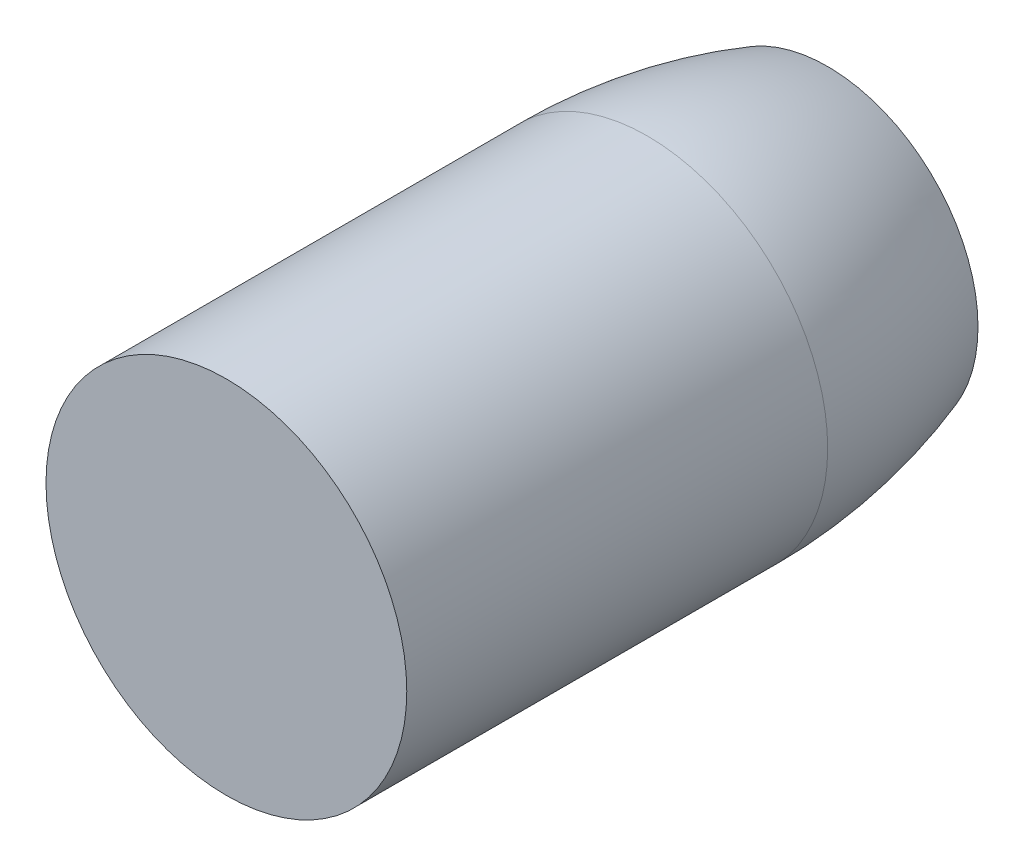
ISO-10303-21;
HEADER;
FILE_DESCRIPTION(('STEP AP214'),'2;1');
FILE_NAME('part.step','',(''),(''),'','','');
FILE_SCHEMA(('AUTOMOTIVE_DESIGN { 1 0 10303 214 1 1 1 1 }'));
ENDSEC;
DATA;
#1=APPLICATION_CONTEXT('core data for automotive mechanical design processes');
#2=APPLICATION_PROTOCOL_DEFINITION('international standard','automotive_design',2000,#1);
#3=PRODUCT_CONTEXT('',#1,'mechanical');
#4=PRODUCT('Part','Part','',(#3));
#5=PRODUCT_RELATED_PRODUCT_CATEGORY('part','',(#4));
#6=PRODUCT_DEFINITION_FORMATION('','',#4);
#7=PRODUCT_DEFINITION_CONTEXT('part definition',#1,'design');
#8=PRODUCT_DEFINITION('design','',#6,#7);
#9=PRODUCT_DEFINITION_SHAPE('','',#8);
#10=(LENGTH_UNIT() NAMED_UNIT(*) SI_UNIT(.MILLI.,.METRE.));
#11=(NAMED_UNIT(*) PLANE_ANGLE_UNIT() SI_UNIT($,.RADIAN.));
#12=(NAMED_UNIT(*) SI_UNIT($,.STERADIAN.) SOLID_ANGLE_UNIT());
#13=UNCERTAINTY_MEASURE_WITH_UNIT(LENGTH_MEASURE(1.E-05),#10,'distance_accuracy_value','');
#14=(GEOMETRIC_REPRESENTATION_CONTEXT(3) GLOBAL_UNCERTAINTY_ASSIGNED_CONTEXT((#13)) GLOBAL_UNIT_ASSIGNED_CONTEXT((#10,
#11,#12)) REPRESENTATION_CONTEXT('',''));
#15=CARTESIAN_POINT('',(0.,0.,0.));
#16=DIRECTION('',(0.,0.,1.));
#17=DIRECTION('',(1.,0.,0.));
#18=AXIS2_PLACEMENT_3D('',#15,#16,#17);
#19=CARTESIAN_POINT('',(0.,0.,0.));
#20=DIRECTION('',(0.,0.,1.));
#21=DIRECTION('',(1.,0.,0.));
#22=AXIS2_PLACEMENT_3D('',#19,#20,#21);
#23=PLANE('',#22);
#24=CARTESIAN_POINT('',(0.,0.,0.));
#25=DIRECTION('',(0.,0.,1.));
#26=DIRECTION('',(1.,0.,0.));
#27=AXIS2_PLACEMENT_3D('',#24,#25,#26);
#28=CIRCLE('',#27,6.);
#29=CARTESIAN_POINT('',(6.,0.,0.));
#30=VERTEX_POINT('',#29);
#31=EDGE_CURVE('E12',#30,#30,#28,.T.);
#32=ORIENTED_EDGE('',*,*,#31,.T.);
#33=EDGE_LOOP('',(#32));
#34=FACE_BOUND('',#33,.T.);
#35=ADVANCED_FACE('F40',(#34),#23,.T.);
#36=CARTESIAN_POINT('',(0.,0.,0.));
#37=DIRECTION('',(0.,0.,1.));
#38=DIRECTION('',(1.,0.,0.));
#39=AXIS2_PLACEMENT_3D('',#36,#37,#38);
#40=CYLINDRICAL_SURFACE('',#39,6.);
#41=CARTESIAN_POINT('',(0.,0.,-14.));
#42=DIRECTION('',(0.,0.,1.));
#43=DIRECTION('',(1.,0.,0.));
#44=AXIS2_PLACEMENT_3D('',#41,#42,#43);
#45=CIRCLE('',#44,6.);
#46=CARTESIAN_POINT('',(6.,0.,-14.));
#47=VERTEX_POINT('',#46);
#48=EDGE_CURVE('E46',#47,#47,#45,.T.);
#49=ORIENTED_EDGE('',*,*,#48,.T.);
#50=EDGE_LOOP('',(#49));
#51=FACE_BOUND('',#50,.T.);
#52=ORIENTED_EDGE('',*,*,#31,.F.);
#53=EDGE_LOOP('',(#52));
#54=FACE_BOUND('',#53,.T.);
#55=ADVANCED_FACE('F75',(#51,#54),#40,.T.);
#56=CARTESIAN_POINT('',(0.,0.,-14.));
#57=DIRECTION('',(0.,0.,1.));
#58=DIRECTION('',(1.,0.,0.));
#59=AXIS2_PLACEMENT_3D('',#56,#57,#58);
#60=DEGENERATE_TOROIDAL_SURFACE('',#59,12.5,18.5,.F.);
#61=CARTESIAN_POINT('',(0.,0.,-20.));
#62=DIRECTION('',(0.,0.,1.));
#63=DIRECTION('',(1.,0.,0.));
#64=AXIS2_PLACEMENT_3D('',#61,#62,#63);
#65=CIRCLE('',#64,5.);
#66=CARTESIAN_POINT('',(5.,0.,-20.));
#67=VERTEX_POINT('',#66);
#68=EDGE_CURVE('E50',#67,#67,#65,.T.);
#69=ORIENTED_EDGE('',*,*,#68,.T.);
#70=EDGE_LOOP('',(#69));
#71=FACE_BOUND('',#70,.T.);
#72=ORIENTED_EDGE('',*,*,#48,.F.);
#73=EDGE_LOOP('',(#72));
#74=FACE_BOUND('',#73,.T.);
#75=ADVANCED_FACE('F79',(#71,#74),#60,.F.);
#76=CARTESIAN_POINT('',(5.00000000000012,0.,-20.));
#77=DIRECTION('',(0.,0.,-1.));
#78=DIRECTION('',(-1.,0.,0.));
#79=AXIS2_PLACEMENT_3D('',#76,#77,#78);
#80=PLANE('',#79);
#81=CARTESIAN_POINT('',(0.,0.,-20.));
#82=DIRECTION('',(0.,0.,1.));
#83=DIRECTION('',(1.,0.,0.));
#84=AXIS2_PLACEMENT_3D('',#81,#82,#83);
#85=CIRCLE('',#84,4.75);
#86=CARTESIAN_POINT('',(4.75,0.,-20.));
#87=VERTEX_POINT('',#86);
#88=EDGE_CURVE('E54',#87,#87,#85,.T.);
#89=ORIENTED_EDGE('',*,*,#88,.T.);
#90=EDGE_LOOP('',(#89));
#91=FACE_BOUND('',#90,.T.);
#92=ORIENTED_EDGE('',*,*,#68,.F.);
#93=EDGE_LOOP('',(#92));
#94=FACE_BOUND('',#93,.T.);
#95=ADVANCED_FACE('F72',(#91,#94),#80,.T.);
#96=CARTESIAN_POINT('',(0.,0.,0.));
#97=DIRECTION('',(0.,0.,1.));
#98=DIRECTION('',(1.,0.,0.));
#99=AXIS2_PLACEMENT_3D('',#96,#97,#98);
#100=CYLINDRICAL_SURFACE('',#99,4.75);
#101=CARTESIAN_POINT('',(0.,0.,-17.));
#102=DIRECTION('',(0.,0.,1.));
#103=DIRECTION('',(1.,0.,0.));
#104=AXIS2_PLACEMENT_3D('',#101,#102,#103);
#105=CIRCLE('',#104,4.75);
#106=CARTESIAN_POINT('',(4.75,0.,-17.));
#107=VERTEX_POINT('',#106);
#108=EDGE_CURVE('E59',#107,#107,#105,.T.);
#109=ORIENTED_EDGE('',*,*,#108,.T.);
#110=EDGE_LOOP('',(#109));
#111=FACE_BOUND('',#110,.T.);
#112=ORIENTED_EDGE('',*,*,#88,.F.);
#113=EDGE_LOOP('',(#112));
#114=FACE_BOUND('',#113,.T.);
#115=ADVANCED_FACE('F63',(#111,#114),#100,.F.);
#116=CARTESIAN_POINT('',(4.75000000000003,0.,-17.));
#117=DIRECTION('',(0.,0.,-1.));
#118=DIRECTION('',(-1.,0.,0.));
#119=AXIS2_PLACEMENT_3D('',#116,#117,#118);
#120=PLANE('',#119);
#121=ORIENTED_EDGE('',*,*,#108,.F.);
#122=EDGE_LOOP('',(#121));
#123=FACE_BOUND('',#122,.T.);
#124=ADVANCED_FACE('F66',(#123),#120,.T.);
#125=CLOSED_SHELL('',(#35,#55,#75,#95,#115,#124));
#126=MANIFOLD_SOLID_BREP('B2',#125);
#127=ADVANCED_BREP_SHAPE_REPRESENTATION('',(#18,#126),#14);
#128=SHAPE_DEFINITION_REPRESENTATION(#9,#127);
ENDSEC;
END-ISO-10303-21;
